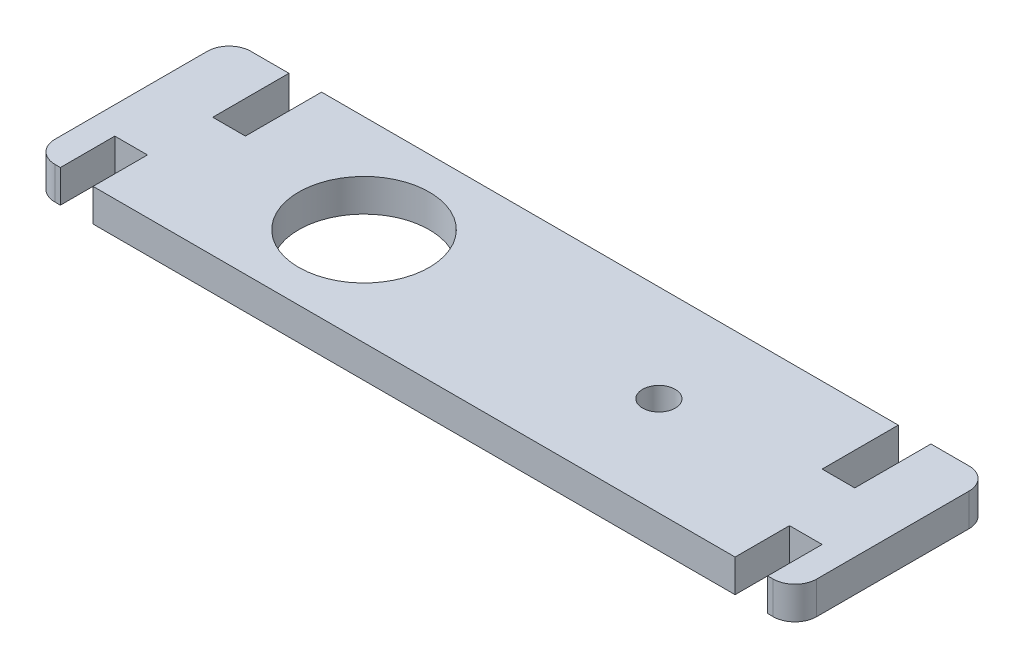
ISO-10303-21;
HEADER;
FILE_DESCRIPTION(('STEP AP214'),'2;1');
FILE_NAME('part.step','',(''),(''),'','','');
FILE_SCHEMA(('AUTOMOTIVE_DESIGN { 1 0 10303 214 1 1 1 1 }'));
ENDSEC;
DATA;
#1=APPLICATION_CONTEXT('core data for automotive mechanical design processes');
#2=APPLICATION_PROTOCOL_DEFINITION('international standard','automotive_design',2000,#1);
#3=PRODUCT_CONTEXT('',#1,'mechanical');
#4=PRODUCT('Part','Part','',(#3));
#5=PRODUCT_RELATED_PRODUCT_CATEGORY('part','',(#4));
#6=PRODUCT_DEFINITION_FORMATION('','',#4);
#7=PRODUCT_DEFINITION_CONTEXT('part definition',#1,'design');
#8=PRODUCT_DEFINITION('design','',#6,#7);
#9=PRODUCT_DEFINITION_SHAPE('','',#8);
#10=(LENGTH_UNIT() NAMED_UNIT(*) SI_UNIT(.MILLI.,.METRE.));
#11=(NAMED_UNIT(*) PLANE_ANGLE_UNIT() SI_UNIT($,.RADIAN.));
#12=(NAMED_UNIT(*) SI_UNIT($,.STERADIAN.) SOLID_ANGLE_UNIT());
#13=UNCERTAINTY_MEASURE_WITH_UNIT(LENGTH_MEASURE(1.E-05),#10,'distance_accuracy_value','');
#14=(GEOMETRIC_REPRESENTATION_CONTEXT(3) GLOBAL_UNCERTAINTY_ASSIGNED_CONTEXT((#13)) GLOBAL_UNIT_ASSIGNED_CONTEXT((#10,
#11,#12)) REPRESENTATION_CONTEXT('',''));
#15=CARTESIAN_POINT('',(0.,0.,0.));
#16=DIRECTION('',(0.,0.,1.));
#17=DIRECTION('',(1.,0.,0.));
#18=AXIS2_PLACEMENT_3D('',#15,#16,#17);
#19=CARTESIAN_POINT('',(62.4161145926589,3.,2.12292688749626));
#20=DIRECTION('',(0.,0.,-1.));
#21=DIRECTION('',(-1.,0.,0.));
#22=AXIS2_PLACEMENT_3D('',#19,#20,#21);
#23=PLANE('',#22);
#24=DIRECTION('',(1.,0.,0.));
#25=VECTOR('',#24,1.);
#26=CARTESIAN_POINT('',(62.4161145926589,0.,2.12292688749626));
#27=LINE('',#26,#25);
#28=CARTESIAN_POINT('',(-0.0838854073410972,0.,2.12292688749627));
#29=VERTEX_POINT('',#28);
#30=CARTESIAN_POINT('',(58.9161145926589,0.,2.12292688749627));
#31=VERTEX_POINT('',#30);
#32=EDGE_CURVE('E224',#29,#31,#27,.T.);
#33=ORIENTED_EDGE('',*,*,#32,.T.);
#34=DIRECTION('',(0.,1.,0.));
#35=VECTOR('',#34,1.);
#36=CARTESIAN_POINT('',(58.9161145926589,0.,2.12292688749627));
#37=LINE('',#36,#35);
#38=CARTESIAN_POINT('',(58.9161145926589,3.,2.12292688749627));
#39=VERTEX_POINT('',#38);
#40=EDGE_CURVE('E206',#31,#39,#37,.T.);
#41=ORIENTED_EDGE('',*,*,#40,.T.);
#42=DIRECTION('',(1.,0.,0.));
#43=VECTOR('',#42,1.);
#44=CARTESIAN_POINT('',(62.4161145926589,3.,2.12292688749626));
#45=LINE('',#44,#43);
#46=CARTESIAN_POINT('',(-0.0838854073410972,3.,2.12292688749627));
#47=VERTEX_POINT('',#46);
#48=EDGE_CURVE('E322',#47,#39,#45,.T.);
#49=ORIENTED_EDGE('',*,*,#48,.F.);
#50=DIRECTION('',(0.,1.,0.));
#51=VECTOR('',#50,1.);
#52=CARTESIAN_POINT('',(-0.0838854073410972,0.,2.12292688749627));
#53=LINE('',#52,#51);
#54=EDGE_CURVE('E231',#29,#47,#53,.T.);
#55=ORIENTED_EDGE('',*,*,#54,.F.);
#56=EDGE_LOOP('',(#33,#41,#49,#55));
#57=FACE_BOUND('',#56,.T.);
#58=ADVANCED_FACE('F44',(#57),#23,.F.);
#59=CARTESIAN_POINT('',(61.9161145926589,3.,2.12292688749627));
#60=VERTEX_POINT('',#59);
#61=CARTESIAN_POINT('',(62.4161145926589,3.,2.12292688749626));
#62=VERTEX_POINT('',#61);
#63=EDGE_CURVE('E323',#60,#62,#45,.T.);
#64=ORIENTED_EDGE('',*,*,#63,.F.);
#65=DIRECTION('',(0.,1.,0.));
#66=VECTOR('',#65,1.);
#67=CARTESIAN_POINT('',(61.9161145926589,0.,2.12292688749627));
#68=LINE('',#67,#66);
#69=CARTESIAN_POINT('',(61.9161145926589,0.,2.12292688749627));
#70=VERTEX_POINT('',#69);
#71=EDGE_CURVE('E217',#70,#60,#68,.T.);
#72=ORIENTED_EDGE('',*,*,#71,.F.);
#73=CARTESIAN_POINT('',(62.4161145926589,0.,2.12292688749626));
#74=VERTEX_POINT('',#73);
#75=EDGE_CURVE('E234',#70,#74,#27,.T.);
#76=ORIENTED_EDGE('',*,*,#75,.T.);
#77=DIRECTION('',(0.,-1.,0.));
#78=VECTOR('',#77,1.);
#79=CARTESIAN_POINT('',(62.4161145926589,3.,2.12292688749626));
#80=LINE('',#79,#78);
#81=EDGE_CURVE('E276',#62,#74,#80,.T.);
#82=ORIENTED_EDGE('',*,*,#81,.F.);
#83=EDGE_LOOP('',(#64,#72,#76,#82));
#84=FACE_BOUND('',#83,.T.);
#85=ADVANCED_FACE('F500',(#84),#23,.F.);
#86=CARTESIAN_POINT('',(-3.58388540734109,3.,-15.8770731125037));
#87=DIRECTION('',(0.,0.,1.));
#88=DIRECTION('',(1.,0.,0.));
#89=AXIS2_PLACEMENT_3D('',#86,#87,#88);
#90=PLANE('',#89);
#91=DIRECTION('',(-1.,0.,0.));
#92=VECTOR('',#91,1.);
#93=CARTESIAN_POINT('',(-3.58388540734109,3.,-15.8770731125037));
#94=LINE('',#93,#92);
#95=CARTESIAN_POINT('',(-0.0838854073410972,3.,-15.8770731125037));
#96=VERTEX_POINT('',#95);
#97=CARTESIAN_POINT('',(-3.58388540734109,3.,-15.8770731125037));
#98=VERTEX_POINT('',#97);
#99=EDGE_CURVE('E308',#96,#98,#94,.T.);
#100=ORIENTED_EDGE('',*,*,#99,.F.);
#101=DIRECTION('',(0.,1.,0.));
#102=VECTOR('',#101,1.);
#103=CARTESIAN_POINT('',(-0.0838854073410972,0.,-15.8770731125037));
#104=LINE('',#103,#102);
#105=CARTESIAN_POINT('',(-0.0838854073410972,0.,-15.8770731125037));
#106=VERTEX_POINT('',#105);
#107=EDGE_CURVE('E301',#106,#96,#104,.T.);
#108=ORIENTED_EDGE('',*,*,#107,.F.);
#109=DIRECTION('',(-1.,0.,0.));
#110=VECTOR('',#109,1.);
#111=CARTESIAN_POINT('',(-3.58388540734109,0.,-15.8770731125037));
#112=LINE('',#111,#110);
#113=CARTESIAN_POINT('',(-3.58388540734109,0.,-15.8770731125037));
#114=VERTEX_POINT('',#113);
#115=EDGE_CURVE('E252',#106,#114,#112,.T.);
#116=ORIENTED_EDGE('',*,*,#115,.T.);
#117=DIRECTION('',(0.,-1.,0.));
#118=VECTOR('',#117,1.);
#119=CARTESIAN_POINT('',(-3.58388540734109,3.,-15.8770731125037));
#120=LINE('',#119,#118);
#121=EDGE_CURVE('E259',#98,#114,#120,.T.);
#122=ORIENTED_EDGE('',*,*,#121,.F.);
#123=EDGE_LOOP('',(#100,#108,#116,#122));
#124=FACE_BOUND('',#123,.T.);
#125=ADVANCED_FACE('F546',(#124),#90,.F.);
#126=CARTESIAN_POINT('',(55.9161145926589,0.,-15.8770731125037));
#127=VERTEX_POINT('',#126);
#128=CARTESIAN_POINT('',(2.91611459265891,0.,-15.8770731125037));
#129=VERTEX_POINT('',#128);
#130=EDGE_CURVE('E258',#127,#129,#112,.T.);
#131=ORIENTED_EDGE('',*,*,#130,.T.);
#132=DIRECTION('',(0.,1.,0.));
#133=VECTOR('',#132,1.);
#134=CARTESIAN_POINT('',(2.91611459265891,0.,-15.8770731125037));
#135=LINE('',#134,#133);
#136=CARTESIAN_POINT('',(2.91611459265891,3.,-15.8770731125037));
#137=VERTEX_POINT('',#136);
#138=EDGE_CURVE('E377',#129,#137,#135,.T.);
#139=ORIENTED_EDGE('',*,*,#138,.T.);
#140=CARTESIAN_POINT('',(55.9161145926589,3.,-15.8770731125037));
#141=VERTEX_POINT('',#140);
#142=EDGE_CURVE('E307',#141,#137,#94,.T.);
#143=ORIENTED_EDGE('',*,*,#142,.F.);
#144=DIRECTION('',(0.,1.,0.));
#145=VECTOR('',#144,1.);
#146=CARTESIAN_POINT('',(55.9161145926589,0.,-15.8770731125037));
#147=LINE('',#146,#145);
#148=EDGE_CURVE('E357',#127,#141,#147,.T.);
#149=ORIENTED_EDGE('',*,*,#148,.F.);
#150=EDGE_LOOP('',(#131,#139,#143,#149));
#151=FACE_BOUND('',#150,.T.);
#152=ADVANCED_FACE('F535',(#151),#90,.F.);
#153=CARTESIAN_POINT('',(-3.58388540734109,3.,-13.8770731125037));
#154=DIRECTION('',(0.,-1.,0.));
#155=DIRECTION('',(0.,0.,-1.));
#156=AXIS2_PLACEMENT_3D('',#153,#154,#155);
#157=CYLINDRICAL_SURFACE('',#156,2.);
#158=CARTESIAN_POINT('',(-3.58388540734109,0.,-13.8770731125037));
#159=DIRECTION('',(0.,1.,0.));
#160=DIRECTION('',(0.,0.,-1.));
#161=AXIS2_PLACEMENT_3D('',#158,#159,#160);
#162=CIRCLE('',#161,2.);
#163=CARTESIAN_POINT('',(-5.58388540734109,0.,-13.8770731125037));
#164=VERTEX_POINT('',#163);
#165=EDGE_CURVE('E298',#114,#164,#162,.T.);
#166=ORIENTED_EDGE('',*,*,#165,.T.);
#167=DIRECTION('',(0.,-1.,0.));
#168=VECTOR('',#167,1.);
#169=CARTESIAN_POINT('',(-5.58388540734109,3.,-13.8770731125037));
#170=LINE('',#169,#168);
#171=CARTESIAN_POINT('',(-5.58388540734109,3.,-13.8770731125037));
#172=VERTEX_POINT('',#171);
#173=EDGE_CURVE('E11',#172,#164,#170,.T.);
#174=ORIENTED_EDGE('',*,*,#173,.F.);
#175=CARTESIAN_POINT('',(-3.58388540734109,3.,-13.8770731125037));
#176=DIRECTION('',(0.,1.,0.));
#177=DIRECTION('',(0.,0.,-1.));
#178=AXIS2_PLACEMENT_3D('',#175,#176,#177);
#179=CIRCLE('',#178,2.);
#180=EDGE_CURVE('E257',#98,#172,#179,.T.);
#181=ORIENTED_EDGE('',*,*,#180,.F.);
#182=ORIENTED_EDGE('',*,*,#121,.T.);
#183=EDGE_LOOP('',(#166,#174,#181,#182));
#184=FACE_BOUND('',#183,.T.);
#185=ADVANCED_FACE('F46',(#184),#157,.T.);
#186=CARTESIAN_POINT('',(-5.58388540734109,3.,0.122926887496269));
#187=DIRECTION('',(1.,0.,0.));
#188=DIRECTION('',(0.,0.,-1.));
#189=AXIS2_PLACEMENT_3D('',#186,#187,#188);
#190=PLANE('',#189);
#191=DIRECTION('',(0.,0.,1.));
#192=VECTOR('',#191,1.);
#193=CARTESIAN_POINT('',(-5.58388540734109,0.,0.122926887496269));
#194=LINE('',#193,#192);
#195=CARTESIAN_POINT('',(-5.58388540734109,0.,0.122926887496269));
#196=VERTEX_POINT('',#195);
#197=EDGE_CURVE('E295',#164,#196,#194,.T.);
#198=ORIENTED_EDGE('',*,*,#197,.T.);
#199=DIRECTION('',(0.,-1.,0.));
#200=VECTOR('',#199,1.);
#201=CARTESIAN_POINT('',(-5.58388540734109,3.,0.122926887496269));
#202=LINE('',#201,#200);
#203=CARTESIAN_POINT('',(-5.58388540734109,3.,0.122926887496269));
#204=VERTEX_POINT('',#203);
#205=EDGE_CURVE('E53',#204,#196,#202,.T.);
#206=ORIENTED_EDGE('',*,*,#205,.F.);
#207=DIRECTION('',(0.,0.,1.));
#208=VECTOR('',#207,1.);
#209=CARTESIAN_POINT('',(-5.58388540734109,3.,0.122926887496269));
#210=LINE('',#209,#208);
#211=EDGE_CURVE('E326',#172,#204,#210,.T.);
#212=ORIENTED_EDGE('',*,*,#211,.F.);
#213=ORIENTED_EDGE('',*,*,#173,.T.);
#214=EDGE_LOOP('',(#198,#206,#212,#213));
#215=FACE_BOUND('',#214,.T.);
#216=ADVANCED_FACE('F549',(#215),#190,.F.);
#217=CARTESIAN_POINT('',(-3.58388540734109,3.,0.122926887496269));
#218=DIRECTION('',(0.,-1.,0.));
#219=DIRECTION('',(0.,0.,-1.));
#220=AXIS2_PLACEMENT_3D('',#217,#218,#219);
#221=CYLINDRICAL_SURFACE('',#220,2.);
#222=CARTESIAN_POINT('',(-3.58388540734109,0.,0.122926887496269));
#223=DIRECTION('',(0.,1.,0.));
#224=DIRECTION('',(0.,0.,-1.));
#225=AXIS2_PLACEMENT_3D('',#222,#223,#224);
#226=CIRCLE('',#225,2.);
#227=CARTESIAN_POINT('',(-3.58388540734109,0.,2.12292688749627));
#228=VERTEX_POINT('',#227);
#229=EDGE_CURVE('E240',#196,#228,#226,.T.);
#230=ORIENTED_EDGE('',*,*,#229,.T.);
#231=DIRECTION('',(0.,-1.,0.));
#232=VECTOR('',#231,1.);
#233=CARTESIAN_POINT('',(-3.58388540734109,3.,2.12292688749627));
#234=LINE('',#233,#232);
#235=CARTESIAN_POINT('',(-3.58388540734109,3.,2.12292688749627));
#236=VERTEX_POINT('',#235);
#237=EDGE_CURVE('E280',#236,#228,#234,.T.);
#238=ORIENTED_EDGE('',*,*,#237,.F.);
#239=CARTESIAN_POINT('',(-3.58388540734109,3.,0.122926887496269));
#240=DIRECTION('',(0.,1.,0.));
#241=DIRECTION('',(0.,0.,-1.));
#242=AXIS2_PLACEMENT_3D('',#239,#240,#241);
#243=CIRCLE('',#242,2.);
#244=EDGE_CURVE('E291',#204,#236,#243,.T.);
#245=ORIENTED_EDGE('',*,*,#244,.F.);
#246=ORIENTED_EDGE('',*,*,#205,.T.);
#247=EDGE_LOOP('',(#230,#238,#245,#246));
#248=FACE_BOUND('',#247,.T.);
#249=ADVANCED_FACE('F289',(#248),#221,.T.);
#250=CARTESIAN_POINT('',(-3.0838854073411,0.,2.12292688749627));
#251=VERTEX_POINT('',#250);
#252=EDGE_CURVE('E233',#228,#251,#27,.T.);
#253=ORIENTED_EDGE('',*,*,#252,.T.);
#254=DIRECTION('',(0.,1.,0.));
#255=VECTOR('',#254,1.);
#256=CARTESIAN_POINT('',(-3.0838854073411,0.,2.12292688749627));
#257=LINE('',#256,#255);
#258=CARTESIAN_POINT('',(-3.0838854073411,3.,2.12292688749627));
#259=VERTEX_POINT('',#258);
#260=EDGE_CURVE('E435',#251,#259,#257,.T.);
#261=ORIENTED_EDGE('',*,*,#260,.T.);
#262=EDGE_CURVE('E318',#236,#259,#45,.T.);
#263=ORIENTED_EDGE('',*,*,#262,.F.);
#264=ORIENTED_EDGE('',*,*,#237,.T.);
#265=EDGE_LOOP('',(#253,#261,#263,#264));
#266=FACE_BOUND('',#265,.T.);
#267=ADVANCED_FACE('F553',(#266),#23,.F.);
#268=CARTESIAN_POINT('',(62.4161145926589,3.,0.12292688749626));
#269=DIRECTION('',(0.,-1.,0.));
#270=DIRECTION('',(0.,0.,-1.));
#271=AXIS2_PLACEMENT_3D('',#268,#269,#270);
#272=CYLINDRICAL_SURFACE('',#271,2.);
#273=CARTESIAN_POINT('',(62.4161145926589,0.,0.12292688749626));
#274=DIRECTION('',(0.,1.,0.));
#275=DIRECTION('',(0.,0.,-1.));
#276=AXIS2_PLACEMENT_3D('',#273,#274,#275);
#277=CIRCLE('',#276,2.);
#278=CARTESIAN_POINT('',(64.4161145926589,0.,0.12292688749626));
#279=VERTEX_POINT('',#278);
#280=EDGE_CURVE('E239',#74,#279,#277,.T.);
#281=ORIENTED_EDGE('',*,*,#280,.T.);
#282=DIRECTION('',(0.,-1.,0.));
#283=VECTOR('',#282,1.);
#284=CARTESIAN_POINT('',(64.4161145926589,3.,0.12292688749626));
#285=LINE('',#284,#283);
#286=CARTESIAN_POINT('',(64.4161145926589,3.,0.12292688749626));
#287=VERTEX_POINT('',#286);
#288=EDGE_CURVE('E272',#287,#279,#285,.T.);
#289=ORIENTED_EDGE('',*,*,#288,.F.);
#290=CARTESIAN_POINT('',(62.4161145926589,3.,0.12292688749626));
#291=DIRECTION('',(0.,1.,0.));
#292=DIRECTION('',(0.,0.,-1.));
#293=AXIS2_PLACEMENT_3D('',#290,#291,#292);
#294=CIRCLE('',#293,2.);
#295=EDGE_CURVE('E315',#62,#287,#294,.T.);
#296=ORIENTED_EDGE('',*,*,#295,.F.);
#297=ORIENTED_EDGE('',*,*,#81,.T.);
#298=EDGE_LOOP('',(#281,#289,#296,#297));
#299=FACE_BOUND('',#298,.T.);
#300=ADVANCED_FACE('F504',(#299),#272,.T.);
#301=CARTESIAN_POINT('',(64.4161145926589,3.,-13.8770731125037));
#302=DIRECTION('',(-1.,0.,0.));
#303=DIRECTION('',(0.,0.,1.));
#304=AXIS2_PLACEMENT_3D('',#301,#302,#303);
#305=PLANE('',#304);
#306=DIRECTION('',(0.,0.,-1.));
#307=VECTOR('',#306,1.);
#308=CARTESIAN_POINT('',(64.4161145926589,0.,-13.8770731125037));
#309=LINE('',#308,#307);
#310=CARTESIAN_POINT('',(64.4161145926589,0.,-13.8770731125037));
#311=VERTEX_POINT('',#310);
#312=EDGE_CURVE('E246',#279,#311,#309,.T.);
#313=ORIENTED_EDGE('',*,*,#312,.T.);
#314=DIRECTION('',(0.,-1.,0.));
#315=VECTOR('',#314,1.);
#316=CARTESIAN_POINT('',(64.4161145926589,3.,-13.8770731125037));
#317=LINE('',#316,#315);
#318=CARTESIAN_POINT('',(64.4161145926589,3.,-13.8770731125037));
#319=VERTEX_POINT('',#318);
#320=EDGE_CURVE('E268',#319,#311,#317,.T.);
#321=ORIENTED_EDGE('',*,*,#320,.F.);
#322=DIRECTION('',(0.,0.,-1.));
#323=VECTOR('',#322,1.);
#324=CARTESIAN_POINT('',(64.4161145926589,3.,-13.8770731125037));
#325=LINE('',#324,#323);
#326=EDGE_CURVE('E312',#287,#319,#325,.T.);
#327=ORIENTED_EDGE('',*,*,#326,.F.);
#328=ORIENTED_EDGE('',*,*,#288,.T.);
#329=EDGE_LOOP('',(#313,#321,#327,#328));
#330=FACE_BOUND('',#329,.T.);
#331=ADVANCED_FACE('F509',(#330),#305,.F.);
#332=CARTESIAN_POINT('',(62.4161145926589,3.,-13.8770731125037));
#333=DIRECTION('',(0.,-1.,0.));
#334=DIRECTION('',(0.,0.,-1.));
#335=AXIS2_PLACEMENT_3D('',#332,#333,#334);
#336=CYLINDRICAL_SURFACE('',#335,2.);
#337=CARTESIAN_POINT('',(62.4161145926589,0.,-13.8770731125037));
#338=DIRECTION('',(0.,1.,0.));
#339=DIRECTION('',(0.,0.,-1.));
#340=AXIS2_PLACEMENT_3D('',#337,#338,#339);
#341=CIRCLE('',#340,2.);
#342=CARTESIAN_POINT('',(62.4161145926589,0.,-15.8770731125037));
#343=VERTEX_POINT('',#342);
#344=EDGE_CURVE('E249',#311,#343,#341,.T.);
#345=ORIENTED_EDGE('',*,*,#344,.T.);
#346=DIRECTION('',(0.,-1.,0.));
#347=VECTOR('',#346,1.);
#348=CARTESIAN_POINT('',(62.4161145926589,3.,-15.8770731125037));
#349=LINE('',#348,#347);
#350=CARTESIAN_POINT('',(62.4161145926589,3.,-15.8770731125037));
#351=VERTEX_POINT('',#350);
#352=EDGE_CURVE('E263',#351,#343,#349,.T.);
#353=ORIENTED_EDGE('',*,*,#352,.F.);
#354=CARTESIAN_POINT('',(62.4161145926589,3.,-13.8770731125037));
#355=DIRECTION('',(0.,1.,0.));
#356=DIRECTION('',(0.,0.,-1.));
#357=AXIS2_PLACEMENT_3D('',#354,#355,#356);
#358=CIRCLE('',#357,2.);
#359=EDGE_CURVE('E309',#319,#351,#358,.T.);
#360=ORIENTED_EDGE('',*,*,#359,.F.);
#361=ORIENTED_EDGE('',*,*,#320,.T.);
#362=EDGE_LOOP('',(#345,#353,#360,#361));
#363=FACE_BOUND('',#362,.T.);
#364=ADVANCED_FACE('F515',(#363),#336,.T.);
#365=CARTESIAN_POINT('',(58.9161145926589,0.,-15.8770731125037));
#366=VERTEX_POINT('',#365);
#367=EDGE_CURVE('E253',#343,#366,#112,.T.);
#368=ORIENTED_EDGE('',*,*,#367,.T.);
#369=DIRECTION('',(0.,1.,0.));
#370=VECTOR('',#369,1.);
#371=CARTESIAN_POINT('',(58.9161145926589,0.,-15.8770731125037));
#372=LINE('',#371,#370);
#373=CARTESIAN_POINT('',(58.9161145926589,3.,-15.8770731125037));
#374=VERTEX_POINT('',#373);
#375=EDGE_CURVE('E360',#366,#374,#372,.T.);
#376=ORIENTED_EDGE('',*,*,#375,.T.);
#377=EDGE_CURVE('E264',#351,#374,#94,.T.);
#378=ORIENTED_EDGE('',*,*,#377,.F.);
#379=ORIENTED_EDGE('',*,*,#352,.T.);
#380=EDGE_LOOP('',(#368,#376,#378,#379));
#381=FACE_BOUND('',#380,.T.);
#382=ADVANCED_FACE('F484',(#381),#90,.F.);
#383=CARTESIAN_POINT('',(-3.58388540734109,3.,-13.8770731125037));
#384=DIRECTION('',(0.,-1.,0.));
#385=DIRECTION('',(0.,0.,-1.));
#386=AXIS2_PLACEMENT_3D('',#383,#384,#385);
#387=PLANE('',#386);
#388=CARTESIAN_POINT('',(15.8161145926589,3.,-6.87707311250373));
#389=DIRECTION('',(0.,1.,0.));
#390=DIRECTION('',(0.,0.,1.));
#391=AXIS2_PLACEMENT_3D('',#388,#389,#390);
#392=CIRCLE('',#391,6.);
#393=CARTESIAN_POINT('',(15.8161145926589,3.,-0.877073112503733));
#394=VERTEX_POINT('',#393);
#395=EDGE_CURVE('E465',#394,#394,#392,.T.);
#396=ORIENTED_EDGE('',*,*,#395,.F.);
#397=EDGE_LOOP('',(#396));
#398=FACE_BOUND('',#397,.T.);
#399=CARTESIAN_POINT('',(42.8161145926589,3.,-6.97707311250373));
#400=DIRECTION('',(0.,1.,0.));
#401=DIRECTION('',(0.,0.,1.));
#402=AXIS2_PLACEMENT_3D('',#399,#400,#401);
#403=CIRCLE('',#402,1.5);
#404=CARTESIAN_POINT('',(42.8161145926589,3.,-5.47707311250372));
#405=VERTEX_POINT('',#404);
#406=EDGE_CURVE('E404',#405,#405,#403,.T.);
#407=ORIENTED_EDGE('',*,*,#406,.F.);
#408=EDGE_LOOP('',(#407));
#409=FACE_BOUND('',#408,.T.);
#410=ORIENTED_EDGE('',*,*,#48,.T.);
#411=DIRECTION('',(0.,0.,1.));
#412=VECTOR('',#411,1.);
#413=CARTESIAN_POINT('',(58.9161145926589,3.,2.12292688749627));
#414=LINE('',#413,#412);
#415=CARTESIAN_POINT('',(58.9161145926589,3.,-2.87707311250373));
#416=VERTEX_POINT('',#415);
#417=EDGE_CURVE('E211',#416,#39,#414,.T.);
#418=ORIENTED_EDGE('',*,*,#417,.F.);
#419=DIRECTION('',(-1.,0.,0.));
#420=VECTOR('',#419,1.);
#421=CARTESIAN_POINT('',(58.9161145926589,3.,-2.87707311250373));
#422=LINE('',#421,#420);
#423=CARTESIAN_POINT('',(61.9161145926589,3.,-2.87707311250373));
#424=VERTEX_POINT('',#423);
#425=EDGE_CURVE('E228',#424,#416,#422,.T.);
#426=ORIENTED_EDGE('',*,*,#425,.F.);
#427=DIRECTION('',(0.,0.,-1.));
#428=VECTOR('',#427,1.);
#429=CARTESIAN_POINT('',(61.9161145926589,3.,2.12292688749627));
#430=LINE('',#429,#428);
#431=EDGE_CURVE('E455',#60,#424,#430,.T.);
#432=ORIENTED_EDGE('',*,*,#431,.F.);
#433=ORIENTED_EDGE('',*,*,#63,.T.);
#434=ORIENTED_EDGE('',*,*,#295,.T.);
#435=ORIENTED_EDGE('',*,*,#326,.T.);
#436=ORIENTED_EDGE('',*,*,#359,.T.);
#437=ORIENTED_EDGE('',*,*,#377,.T.);
#438=DIRECTION('',(0.,0.,-1.));
#439=VECTOR('',#438,1.);
#440=CARTESIAN_POINT('',(58.9161145926589,3.,-15.8770731125037));
#441=LINE('',#440,#439);
#442=CARTESIAN_POINT('',(58.9161145926589,3.,-8.87707311250372));
#443=VERTEX_POINT('',#442);
#444=EDGE_CURVE('E336',#443,#374,#441,.T.);
#445=ORIENTED_EDGE('',*,*,#444,.F.);
#446=DIRECTION('',(1.,0.,0.));
#447=VECTOR('',#446,1.);
#448=CARTESIAN_POINT('',(55.9161145926589,3.,-8.87707311250372));
#449=LINE('',#448,#447);
#450=CARTESIAN_POINT('',(55.9161145926589,3.,-8.87707311250372));
#451=VERTEX_POINT('',#450);
#452=EDGE_CURVE('E351',#451,#443,#449,.T.);
#453=ORIENTED_EDGE('',*,*,#452,.F.);
#454=DIRECTION('',(0.,0.,1.));
#455=VECTOR('',#454,1.);
#456=CARTESIAN_POINT('',(55.9161145926589,3.,-15.8770731125037));
#457=LINE('',#456,#455);
#458=EDGE_CURVE('E346',#141,#451,#457,.T.);
#459=ORIENTED_EDGE('',*,*,#458,.F.);
#460=ORIENTED_EDGE('',*,*,#142,.T.);
#461=DIRECTION('',(0.,0.,-1.));
#462=VECTOR('',#461,1.);
#463=CARTESIAN_POINT('',(2.91611459265891,3.,-15.8770731125037));
#464=LINE('',#463,#462);
#465=CARTESIAN_POINT('',(2.91611459265891,3.,-8.87707311250372));
#466=VERTEX_POINT('',#465);
#467=EDGE_CURVE('E383',#466,#137,#464,.T.);
#468=ORIENTED_EDGE('',*,*,#467,.F.);
#469=DIRECTION('',(1.,0.,0.));
#470=VECTOR('',#469,1.);
#471=CARTESIAN_POINT('',(-0.0838854073410928,3.,-8.87707311250372));
#472=LINE('',#471,#470);
#473=CARTESIAN_POINT('',(-0.0838854073410928,3.,-8.87707311250372));
#474=VERTEX_POINT('',#473);
#475=EDGE_CURVE('E387',#474,#466,#472,.T.);
#476=ORIENTED_EDGE('',*,*,#475,.F.);
#477=DIRECTION('',(0.,0.,1.));
#478=VECTOR('',#477,1.);
#479=CARTESIAN_POINT('',(-0.0838854073410972,3.,-15.8770731125037));
#480=LINE('',#479,#478);
#481=EDGE_CURVE('E350',#96,#474,#480,.T.);
#482=ORIENTED_EDGE('',*,*,#481,.F.);
#483=ORIENTED_EDGE('',*,*,#99,.T.);
#484=ORIENTED_EDGE('',*,*,#180,.T.);
#485=ORIENTED_EDGE('',*,*,#211,.T.);
#486=ORIENTED_EDGE('',*,*,#244,.T.);
#487=ORIENTED_EDGE('',*,*,#262,.T.);
#488=DIRECTION('',(0.,0.,1.));
#489=VECTOR('',#488,1.);
#490=CARTESIAN_POINT('',(-3.0838854073411,3.,2.12292688749627));
#491=LINE('',#490,#489);
#492=CARTESIAN_POINT('',(-3.0838854073411,3.,-2.87707311250374));
#493=VERTEX_POINT('',#492);
#494=EDGE_CURVE('E415',#493,#259,#491,.T.);
#495=ORIENTED_EDGE('',*,*,#494,.F.);
#496=DIRECTION('',(-1.,0.,0.));
#497=VECTOR('',#496,1.);
#498=CARTESIAN_POINT('',(-0.0838854073410972,3.,-2.87707311250374));
#499=LINE('',#498,#497);
#500=CARTESIAN_POINT('',(-0.0838854073410972,3.,-2.87707311250374));
#501=VERTEX_POINT('',#500);
#502=EDGE_CURVE('E427',#501,#493,#499,.T.);
#503=ORIENTED_EDGE('',*,*,#502,.F.);
#504=DIRECTION('',(0.,0.,-1.));
#505=VECTOR('',#504,1.);
#506=CARTESIAN_POINT('',(-0.0838854073410972,3.,2.12292688749627));
#507=LINE('',#506,#505);
#508=EDGE_CURVE('E423',#47,#501,#507,.T.);
#509=ORIENTED_EDGE('',*,*,#508,.F.);
#510=EDGE_LOOP('',(#410,#418,#426,#432,#433,#434,#435,#436,#437,#445,#453,#459,#460,#468,#476,
#482,#483,#484,#485,#486,#487,#495,#503,#509));
#511=FACE_BOUND('',#510,.T.);
#512=ADVANCED_FACE('F481',(#398,#409,#511),#387,.F.);
#513=CARTESIAN_POINT('',(-3.58388540734109,0.,-13.8770731125037));
#514=DIRECTION('',(0.,-1.,0.));
#515=DIRECTION('',(0.,0.,-1.));
#516=AXIS2_PLACEMENT_3D('',#513,#514,#515);
#517=PLANE('',#516);
#518=CARTESIAN_POINT('',(15.8161145926589,0.,-6.87707311250373));
#519=DIRECTION('',(0.,1.,0.));
#520=DIRECTION('',(0.,0.,1.));
#521=AXIS2_PLACEMENT_3D('',#518,#519,#520);
#522=CIRCLE('',#521,6.);
#523=CARTESIAN_POINT('',(15.8161145926589,0.,-0.877073112503733));
#524=VERTEX_POINT('',#523);
#525=EDGE_CURVE('E436',#524,#524,#522,.T.);
#526=ORIENTED_EDGE('',*,*,#525,.T.);
#527=EDGE_LOOP('',(#526));
#528=FACE_BOUND('',#527,.T.);
#529=DIRECTION('',(0.,0.,1.));
#530=VECTOR('',#529,1.);
#531=CARTESIAN_POINT('',(58.9161145926589,0.,2.12292688749627));
#532=LINE('',#531,#530);
#533=CARTESIAN_POINT('',(58.9161145926589,0.,-2.87707311250373));
#534=VERTEX_POINT('',#533);
#535=EDGE_CURVE('E209',#534,#31,#532,.T.);
#536=ORIENTED_EDGE('',*,*,#535,.T.);
#537=ORIENTED_EDGE('',*,*,#32,.F.);
#538=DIRECTION('',(0.,0.,-1.));
#539=VECTOR('',#538,1.);
#540=CARTESIAN_POINT('',(-0.0838854073410972,0.,2.12292688749627));
#541=LINE('',#540,#539);
#542=CARTESIAN_POINT('',(-0.0838854073410972,0.,-2.87707311250374));
#543=VERTEX_POINT('',#542);
#544=EDGE_CURVE('E412',#29,#543,#541,.T.);
#545=ORIENTED_EDGE('',*,*,#544,.T.);
#546=DIRECTION('',(-1.,0.,0.));
#547=VECTOR('',#546,1.);
#548=CARTESIAN_POINT('',(-0.0838854073410972,0.,-2.87707311250374));
#549=LINE('',#548,#547);
#550=CARTESIAN_POINT('',(-3.0838854073411,0.,-2.87707311250374));
#551=VERTEX_POINT('',#550);
#552=EDGE_CURVE('E416',#543,#551,#549,.T.);
#553=ORIENTED_EDGE('',*,*,#552,.T.);
#554=DIRECTION('',(0.,0.,1.));
#555=VECTOR('',#554,1.);
#556=CARTESIAN_POINT('',(-3.0838854073411,0.,2.12292688749627));
#557=LINE('',#556,#555);
#558=EDGE_CURVE('E68',#551,#251,#557,.T.);
#559=ORIENTED_EDGE('',*,*,#558,.T.);
#560=ORIENTED_EDGE('',*,*,#252,.F.);
#561=ORIENTED_EDGE('',*,*,#229,.F.);
#562=ORIENTED_EDGE('',*,*,#197,.F.);
#563=ORIENTED_EDGE('',*,*,#165,.F.);
#564=ORIENTED_EDGE('',*,*,#115,.F.);
#565=DIRECTION('',(0.,0.,1.));
#566=VECTOR('',#565,1.);
#567=CARTESIAN_POINT('',(-0.0838854073410972,0.,-15.8770731125037));
#568=LINE('',#567,#566);
#569=CARTESIAN_POINT('',(-0.0838854073410928,0.,-8.87707311250372));
#570=VERTEX_POINT('',#569);
#571=EDGE_CURVE('E386',#106,#570,#568,.T.);
#572=ORIENTED_EDGE('',*,*,#571,.T.);
#573=DIRECTION('',(1.,0.,0.));
#574=VECTOR('',#573,1.);
#575=CARTESIAN_POINT('',(-0.0838854073410928,0.,-8.87707311250372));
#576=LINE('',#575,#574);
#577=CARTESIAN_POINT('',(2.91611459265891,0.,-8.87707311250372));
#578=VERTEX_POINT('',#577);
#579=EDGE_CURVE('E397',#570,#578,#576,.T.);
#580=ORIENTED_EDGE('',*,*,#579,.T.);
#581=DIRECTION('',(0.,0.,-1.));
#582=VECTOR('',#581,1.);
#583=CARTESIAN_POINT('',(2.91611459265891,0.,-15.8770731125037));
#584=LINE('',#583,#582);
#585=EDGE_CURVE('E374',#578,#129,#584,.T.);
#586=ORIENTED_EDGE('',*,*,#585,.T.);
#587=ORIENTED_EDGE('',*,*,#130,.F.);
#588=DIRECTION('',(0.,0.,1.));
#589=VECTOR('',#588,1.);
#590=CARTESIAN_POINT('',(55.9161145926589,0.,-15.8770731125037));
#591=LINE('',#590,#589);
#592=CARTESIAN_POINT('',(55.9161145926589,0.,-8.87707311250372));
#593=VERTEX_POINT('',#592);
#594=EDGE_CURVE('E332',#127,#593,#591,.T.);
#595=ORIENTED_EDGE('',*,*,#594,.T.);
#596=DIRECTION('',(1.,0.,0.));
#597=VECTOR('',#596,1.);
#598=CARTESIAN_POINT('',(55.9161145926589,0.,-8.87707311250372));
#599=LINE('',#598,#597);
#600=CARTESIAN_POINT('',(58.9161145926589,0.,-8.87707311250372));
#601=VERTEX_POINT('',#600);
#602=EDGE_CURVE('E337',#593,#601,#599,.T.);
#603=ORIENTED_EDGE('',*,*,#602,.T.);
#604=DIRECTION('',(0.,0.,-1.));
#605=VECTOR('',#604,1.);
#606=CARTESIAN_POINT('',(58.9161145926589,0.,-15.8770731125037));
#607=LINE('',#606,#605);
#608=EDGE_CURVE('E341',#601,#366,#607,.T.);
#609=ORIENTED_EDGE('',*,*,#608,.T.);
#610=ORIENTED_EDGE('',*,*,#367,.F.);
#611=ORIENTED_EDGE('',*,*,#344,.F.);
#612=ORIENTED_EDGE('',*,*,#312,.F.);
#613=ORIENTED_EDGE('',*,*,#280,.F.);
#614=ORIENTED_EDGE('',*,*,#75,.F.);
#615=DIRECTION('',(0.,0.,-1.));
#616=VECTOR('',#615,1.);
#617=CARTESIAN_POINT('',(61.9161145926589,0.,2.12292688749627));
#618=LINE('',#617,#616);
#619=CARTESIAN_POINT('',(61.9161145926589,0.,-2.87707311250373));
#620=VERTEX_POINT('',#619);
#621=EDGE_CURVE('E227',#70,#620,#618,.T.);
#622=ORIENTED_EDGE('',*,*,#621,.T.);
#623=DIRECTION('',(-1.,0.,0.));
#624=VECTOR('',#623,1.);
#625=CARTESIAN_POINT('',(58.9161145926589,0.,-2.87707311250373));
#626=LINE('',#625,#624);
#627=EDGE_CURVE('E60',#620,#534,#626,.T.);
#628=ORIENTED_EDGE('',*,*,#627,.T.);
#629=EDGE_LOOP('',(#536,#537,#545,#553,#559,#560,#561,#562,#563,#564,#572,#580,#586,#587,#595,
#603,#609,#610,#611,#612,#613,#614,#622,#628));
#630=FACE_BOUND('',#629,.T.);
#631=CARTESIAN_POINT('',(42.8161145926589,0.,-6.97707311250373));
#632=DIRECTION('',(0.,1.,0.));
#633=DIRECTION('',(0.,0.,1.));
#634=AXIS2_PLACEMENT_3D('',#631,#632,#633);
#635=CIRCLE('',#634,1.5);
#636=CARTESIAN_POINT('',(42.8161145926589,0.,-5.47707311250372));
#637=VERTEX_POINT('',#636);
#638=EDGE_CURVE('E361',#637,#637,#635,.T.);
#639=ORIENTED_EDGE('',*,*,#638,.T.);
#640=EDGE_LOOP('',(#639));
#641=FACE_BOUND('',#640,.T.);
#642=ADVANCED_FACE('F221',(#528,#630,#641),#517,.T.);
#643=CARTESIAN_POINT('',(55.9161145926589,0.,-15.8770731125037));
#644=DIRECTION('',(-1.,0.,0.));
#645=DIRECTION('',(0.,0.,1.));
#646=AXIS2_PLACEMENT_3D('',#643,#644,#645);
#647=PLANE('',#646);
#648=ORIENTED_EDGE('',*,*,#458,.T.);
#649=DIRECTION('',(0.,1.,0.));
#650=VECTOR('',#649,1.);
#651=CARTESIAN_POINT('',(55.9161145926589,0.,-8.87707311250372));
#652=LINE('',#651,#650);
#653=EDGE_CURVE('E345',#593,#451,#652,.T.);
#654=ORIENTED_EDGE('',*,*,#653,.F.);
#655=ORIENTED_EDGE('',*,*,#594,.F.);
#656=ORIENTED_EDGE('',*,*,#148,.T.);
#657=EDGE_LOOP('',(#648,#654,#655,#656));
#658=FACE_BOUND('',#657,.T.);
#659=ADVANCED_FACE('F654',(#658),#647,.F.);
#660=CARTESIAN_POINT('',(58.9161145926589,0.,-15.8770731125037));
#661=DIRECTION('',(1.,0.,0.));
#662=DIRECTION('',(0.,0.,-1.));
#663=AXIS2_PLACEMENT_3D('',#660,#661,#662);
#664=PLANE('',#663);
#665=ORIENTED_EDGE('',*,*,#444,.T.);
#666=ORIENTED_EDGE('',*,*,#375,.F.);
#667=ORIENTED_EDGE('',*,*,#608,.F.);
#668=DIRECTION('',(0.,1.,0.));
#669=VECTOR('',#668,1.);
#670=CARTESIAN_POINT('',(58.9161145926589,0.,-8.87707311250372));
#671=LINE('',#670,#669);
#672=EDGE_CURVE('E365',#601,#443,#671,.T.);
#673=ORIENTED_EDGE('',*,*,#672,.T.);
#674=EDGE_LOOP('',(#665,#666,#667,#673));
#675=FACE_BOUND('',#674,.T.);
#676=ADVANCED_FACE('F520',(#675),#664,.F.);
#677=CARTESIAN_POINT('',(55.9161145926589,0.,-8.87707311250372));
#678=DIRECTION('',(0.,0.,1.));
#679=DIRECTION('',(1.,0.,0.));
#680=AXIS2_PLACEMENT_3D('',#677,#678,#679);
#681=PLANE('',#680);
#682=ORIENTED_EDGE('',*,*,#452,.T.);
#683=ORIENTED_EDGE('',*,*,#672,.F.);
#684=ORIENTED_EDGE('',*,*,#602,.F.);
#685=ORIENTED_EDGE('',*,*,#653,.T.);
#686=EDGE_LOOP('',(#682,#683,#684,#685));
#687=FACE_BOUND('',#686,.T.);
#688=ADVANCED_FACE('F525',(#687),#681,.F.);
#689=CARTESIAN_POINT('',(-0.0838854073410972,0.,-15.8770731125037));
#690=DIRECTION('',(-1.,0.,0.));
#691=DIRECTION('',(0.,0.,1.));
#692=AXIS2_PLACEMENT_3D('',#689,#690,#691);
#693=PLANE('',#692);
#694=ORIENTED_EDGE('',*,*,#481,.T.);
#695=DIRECTION('',(0.,1.,0.));
#696=VECTOR('',#695,1.);
#697=CARTESIAN_POINT('',(-0.0838854073410928,0.,-8.87707311250372));
#698=LINE('',#697,#696);
#699=EDGE_CURVE('E370',#570,#474,#698,.T.);
#700=ORIENTED_EDGE('',*,*,#699,.F.);
#701=ORIENTED_EDGE('',*,*,#571,.F.);
#702=ORIENTED_EDGE('',*,*,#107,.T.);
#703=EDGE_LOOP('',(#694,#700,#701,#702));
#704=FACE_BOUND('',#703,.T.);
#705=ADVANCED_FACE('F684',(#704),#693,.F.);
#706=CARTESIAN_POINT('',(2.91611459265891,0.,-15.8770731125037));
#707=DIRECTION('',(1.,0.,0.));
#708=DIRECTION('',(0.,0.,-1.));
#709=AXIS2_PLACEMENT_3D('',#706,#707,#708);
#710=PLANE('',#709);
#711=ORIENTED_EDGE('',*,*,#467,.T.);
#712=ORIENTED_EDGE('',*,*,#138,.F.);
#713=ORIENTED_EDGE('',*,*,#585,.F.);
#714=DIRECTION('',(0.,1.,0.));
#715=VECTOR('',#714,1.);
#716=CARTESIAN_POINT('',(2.91611459265891,0.,-8.87707311250372));
#717=LINE('',#716,#715);
#718=EDGE_CURVE('E373',#578,#466,#717,.T.);
#719=ORIENTED_EDGE('',*,*,#718,.T.);
#720=EDGE_LOOP('',(#711,#712,#713,#719));
#721=FACE_BOUND('',#720,.T.);
#722=ADVANCED_FACE('F692',(#721),#710,.F.);
#723=CARTESIAN_POINT('',(-0.0838854073410928,0.,-8.87707311250372));
#724=DIRECTION('',(0.,0.,1.));
#725=DIRECTION('',(1.,0.,0.));
#726=AXIS2_PLACEMENT_3D('',#723,#724,#725);
#727=PLANE('',#726);
#728=ORIENTED_EDGE('',*,*,#475,.T.);
#729=ORIENTED_EDGE('',*,*,#718,.F.);
#730=ORIENTED_EDGE('',*,*,#579,.F.);
#731=ORIENTED_EDGE('',*,*,#699,.T.);
#732=EDGE_LOOP('',(#728,#729,#730,#731));
#733=FACE_BOUND('',#732,.T.);
#734=ADVANCED_FACE('F569',(#733),#727,.F.);
#735=CARTESIAN_POINT('',(42.8161145926589,0.,-6.97707311250373));
#736=DIRECTION('',(0.,1.,0.));
#737=DIRECTION('',(0.,0.,1.));
#738=AXIS2_PLACEMENT_3D('',#735,#736,#737);
#739=CYLINDRICAL_SURFACE('',#738,1.5);
#740=ORIENTED_EDGE('',*,*,#638,.F.);
#741=EDGE_LOOP('',(#740));
#742=FACE_BOUND('',#741,.T.);
#743=ORIENTED_EDGE('',*,*,#406,.T.);
#744=EDGE_LOOP('',(#743));
#745=FACE_BOUND('',#744,.T.);
#746=ADVANCED_FACE('F561',(#742,#745),#739,.F.);
#747=CARTESIAN_POINT('',(-0.0838854073410972,0.,2.12292688749627));
#748=DIRECTION('',(1.,0.,0.));
#749=DIRECTION('',(0.,0.,-1.));
#750=AXIS2_PLACEMENT_3D('',#747,#748,#749);
#751=PLANE('',#750);
#752=ORIENTED_EDGE('',*,*,#508,.T.);
#753=DIRECTION('',(0.,1.,0.));
#754=VECTOR('',#753,1.);
#755=CARTESIAN_POINT('',(-0.0838854073410972,0.,-2.87707311250374));
#756=LINE('',#755,#754);
#757=EDGE_CURVE('E422',#543,#501,#756,.T.);
#758=ORIENTED_EDGE('',*,*,#757,.F.);
#759=ORIENTED_EDGE('',*,*,#544,.F.);
#760=ORIENTED_EDGE('',*,*,#54,.T.);
#761=EDGE_LOOP('',(#752,#758,#759,#760));
#762=FACE_BOUND('',#761,.T.);
#763=ADVANCED_FACE('F559',(#762),#751,.F.);
#764=CARTESIAN_POINT('',(-3.0838854073411,0.,2.12292688749627));
#765=DIRECTION('',(-1.,0.,0.));
#766=DIRECTION('',(0.,0.,1.));
#767=AXIS2_PLACEMENT_3D('',#764,#765,#766);
#768=PLANE('',#767);
#769=ORIENTED_EDGE('',*,*,#494,.T.);
#770=ORIENTED_EDGE('',*,*,#260,.F.);
#771=ORIENTED_EDGE('',*,*,#558,.F.);
#772=DIRECTION('',(0.,1.,0.));
#773=VECTOR('',#772,1.);
#774=CARTESIAN_POINT('',(-3.0838854073411,0.,-2.87707311250374));
#775=LINE('',#774,#773);
#776=EDGE_CURVE('E440',#551,#493,#775,.T.);
#777=ORIENTED_EDGE('',*,*,#776,.T.);
#778=EDGE_LOOP('',(#769,#770,#771,#777));
#779=FACE_BOUND('',#778,.T.);
#780=ADVANCED_FACE('F554',(#779),#768,.F.);
#781=CARTESIAN_POINT('',(-0.0838854073410972,0.,-2.87707311250374));
#782=DIRECTION('',(0.,0.,-1.));
#783=DIRECTION('',(-1.,0.,0.));
#784=AXIS2_PLACEMENT_3D('',#781,#782,#783);
#785=PLANE('',#784);
#786=ORIENTED_EDGE('',*,*,#502,.T.);
#787=ORIENTED_EDGE('',*,*,#776,.F.);
#788=ORIENTED_EDGE('',*,*,#552,.F.);
#789=ORIENTED_EDGE('',*,*,#757,.T.);
#790=EDGE_LOOP('',(#786,#787,#788,#789));
#791=FACE_BOUND('',#790,.T.);
#792=ADVANCED_FACE('F557',(#791),#785,.F.);
#793=CARTESIAN_POINT('',(58.9161145926589,0.,2.12292688749627));
#794=DIRECTION('',(-1.,0.,0.));
#795=DIRECTION('',(0.,0.,1.));
#796=AXIS2_PLACEMENT_3D('',#793,#794,#795);
#797=PLANE('',#796);
#798=ORIENTED_EDGE('',*,*,#417,.T.);
#799=ORIENTED_EDGE('',*,*,#40,.F.);
#800=ORIENTED_EDGE('',*,*,#535,.F.);
#801=DIRECTION('',(0.,1.,0.));
#802=VECTOR('',#801,1.);
#803=CARTESIAN_POINT('',(58.9161145926589,0.,-2.87707311250373));
#804=LINE('',#803,#802);
#805=EDGE_CURVE('E408',#534,#416,#804,.T.);
#806=ORIENTED_EDGE('',*,*,#805,.T.);
#807=EDGE_LOOP('',(#798,#799,#800,#806));
#808=FACE_BOUND('',#807,.T.);
#809=ADVANCED_FACE('F208',(#808),#797,.F.);
#810=CARTESIAN_POINT('',(58.9161145926589,0.,-2.87707311250373));
#811=DIRECTION('',(0.,0.,-1.));
#812=DIRECTION('',(-1.,0.,0.));
#813=AXIS2_PLACEMENT_3D('',#810,#811,#812);
#814=PLANE('',#813);
#815=ORIENTED_EDGE('',*,*,#425,.T.);
#816=ORIENTED_EDGE('',*,*,#805,.F.);
#817=ORIENTED_EDGE('',*,*,#627,.F.);
#818=DIRECTION('',(0.,1.,0.));
#819=VECTOR('',#818,1.);
#820=CARTESIAN_POINT('',(61.9161145926589,0.,-2.87707311250373));
#821=LINE('',#820,#819);
#822=EDGE_CURVE('E447',#620,#424,#821,.T.);
#823=ORIENTED_EDGE('',*,*,#822,.T.);
#824=EDGE_LOOP('',(#815,#816,#817,#823));
#825=FACE_BOUND('',#824,.T.);
#826=ADVANCED_FACE('F747',(#825),#814,.F.);
#827=CARTESIAN_POINT('',(61.9161145926589,0.,2.12292688749627));
#828=DIRECTION('',(1.,0.,0.));
#829=DIRECTION('',(0.,0.,-1.));
#830=AXIS2_PLACEMENT_3D('',#827,#828,#829);
#831=PLANE('',#830);
#832=ORIENTED_EDGE('',*,*,#431,.T.);
#833=ORIENTED_EDGE('',*,*,#822,.F.);
#834=ORIENTED_EDGE('',*,*,#621,.F.);
#835=ORIENTED_EDGE('',*,*,#71,.T.);
#836=EDGE_LOOP('',(#832,#833,#834,#835));
#837=FACE_BOUND('',#836,.T.);
#838=ADVANCED_FACE('F477',(#837),#831,.F.);
#839=CARTESIAN_POINT('',(15.8161145926589,0.,-6.87707311250373));
#840=DIRECTION('',(0.,1.,0.));
#841=DIRECTION('',(0.,0.,1.));
#842=AXIS2_PLACEMENT_3D('',#839,#840,#841);
#843=CYLINDRICAL_SURFACE('',#842,6.);
#844=ORIENTED_EDGE('',*,*,#525,.F.);
#845=EDGE_LOOP('',(#844));
#846=FACE_BOUND('',#845,.T.);
#847=ORIENTED_EDGE('',*,*,#395,.T.);
#848=EDGE_LOOP('',(#847));
#849=FACE_BOUND('',#848,.T.);
#850=ADVANCED_FACE('F474',(#846,#849),#843,.F.);
#851=CLOSED_SHELL('',(#58,#85,#125,#152,#185,#216,#249,#267,#300,#331,#364,#382,#512,#642,#659,
#676,#688,#705,#722,#734,#746,#763,#780,#792,#809,#826,#838,#850));
#852=MANIFOLD_SOLID_BREP('B2',#851);
#853=ADVANCED_BREP_SHAPE_REPRESENTATION('',(#18,#852),#14);
#854=SHAPE_DEFINITION_REPRESENTATION(#9,#853);
ENDSEC;
END-ISO-10303-21;
